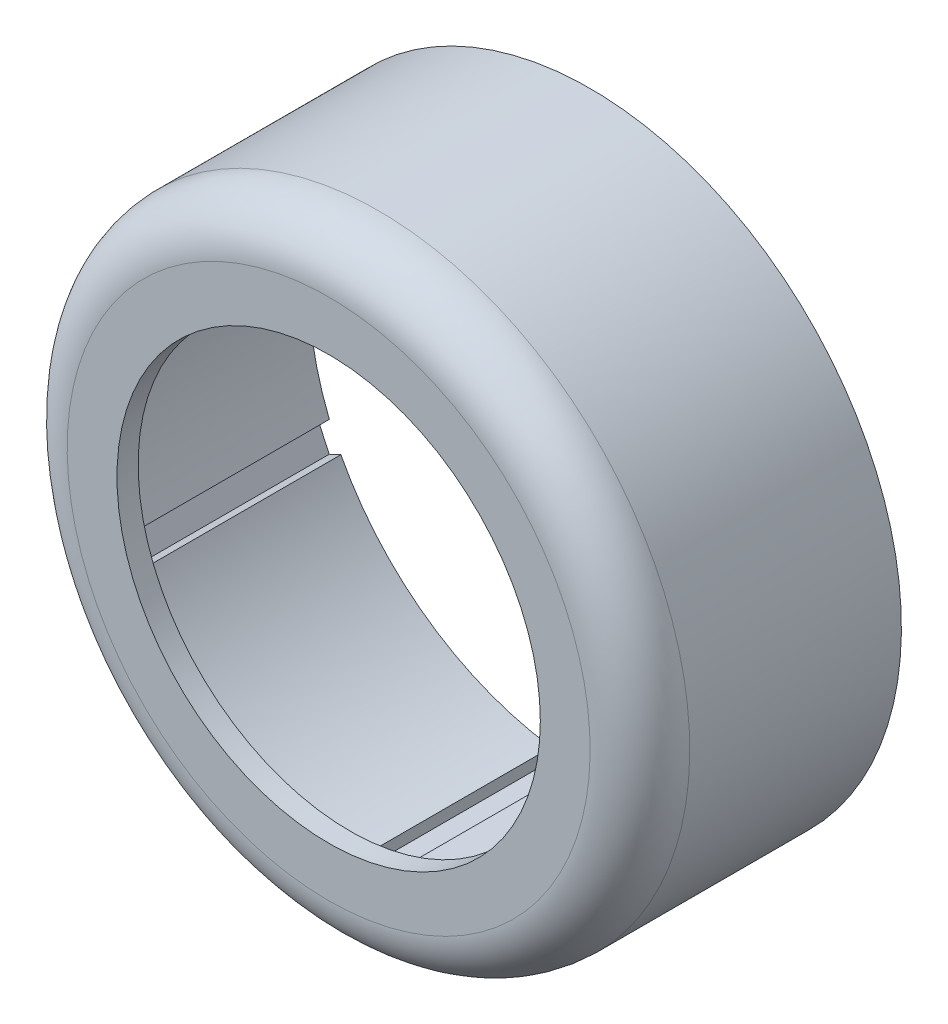
ISO-10303-21;
HEADER;
FILE_DESCRIPTION(('STEP AP214'),'2;1');
FILE_NAME('part.step','',(''),(''),'','','');
FILE_SCHEMA(('AUTOMOTIVE_DESIGN { 1 0 10303 214 1 1 1 1 }'));
ENDSEC;
DATA;
#1=APPLICATION_CONTEXT('core data for automotive mechanical design processes');
#2=APPLICATION_PROTOCOL_DEFINITION('international standard','automotive_design',2000,#1);
#3=PRODUCT_CONTEXT('',#1,'mechanical');
#4=PRODUCT('Part','Part','',(#3));
#5=PRODUCT_RELATED_PRODUCT_CATEGORY('part','',(#4));
#6=PRODUCT_DEFINITION_FORMATION('','',#4);
#7=PRODUCT_DEFINITION_CONTEXT('part definition',#1,'design');
#8=PRODUCT_DEFINITION('design','',#6,#7);
#9=PRODUCT_DEFINITION_SHAPE('','',#8);
#10=(LENGTH_UNIT() NAMED_UNIT(*) SI_UNIT(.MILLI.,.METRE.));
#11=(NAMED_UNIT(*) PLANE_ANGLE_UNIT() SI_UNIT($,.RADIAN.));
#12=(NAMED_UNIT(*) SI_UNIT($,.STERADIAN.) SOLID_ANGLE_UNIT());
#13=UNCERTAINTY_MEASURE_WITH_UNIT(LENGTH_MEASURE(1.E-05),#10,'distance_accuracy_value','');
#14=(GEOMETRIC_REPRESENTATION_CONTEXT(3) GLOBAL_UNCERTAINTY_ASSIGNED_CONTEXT((#13)) GLOBAL_UNIT_ASSIGNED_CONTEXT((#10,
#11,#12)) REPRESENTATION_CONTEXT('',''));
#15=CARTESIAN_POINT('',(0.,0.,0.));
#16=DIRECTION('',(0.,0.,1.));
#17=DIRECTION('',(1.,0.,0.));
#18=AXIS2_PLACEMENT_3D('',#15,#16,#17);
#19=CARTESIAN_POINT('',(0.,0.,-221.545741472244));
#20=DIRECTION('',(0.,0.,-1.));
#21=DIRECTION('',(-1.,0.,0.));
#22=AXIS2_PLACEMENT_3D('',#19,#20,#21);
#23=CYLINDRICAL_SURFACE('',#22,22.6);
#24=DIRECTION('',(0.,0.,-1.));
#25=VECTOR('',#24,1.);
#26=CARTESIAN_POINT('',(-19.091867612019,12.0938245019985,-221.545741472244));
#27=LINE('',#26,#25);
#28=CARTESIAN_POINT('',(-19.091867612019,12.0938245019985,-223.245741472244));
#29=VERTEX_POINT('',#28);
#30=CARTESIAN_POINT('',(-19.091867612019,12.0938245019985,-242.545741472244));
#31=VERTEX_POINT('',#30);
#32=EDGE_CURVE('E221',#29,#31,#27,.T.);
#33=ORIENTED_EDGE('',*,*,#32,.F.);
#34=CARTESIAN_POINT('',(0.,0.,-223.245741472244));
#35=DIRECTION('',(0.,0.,1.));
#36=DIRECTION('',(1.,0.,0.));
#37=AXIS2_PLACEMENT_3D('',#34,#35,#36);
#38=CIRCLE('',#37,22.6);
#39=CARTESIAN_POINT('',(-20.9443010701167,-8.49095122376218,-223.245741472244));
#40=VERTEX_POINT('',#39);
#41=EDGE_CURVE('E51',#29,#40,#38,.T.);
#42=ORIENTED_EDGE('',*,*,#41,.T.);
#43=DIRECTION('',(0.,0.,-1.));
#44=VECTOR('',#43,1.);
#45=CARTESIAN_POINT('',(-20.9443010701167,-8.49095122376218,-221.545741472244));
#46=LINE('',#45,#44);
#47=CARTESIAN_POINT('',(-20.9443010701167,-8.49095122376218,-242.545741472244));
#48=VERTEX_POINT('',#47);
#49=EDGE_CURVE('E205',#40,#48,#46,.T.);
#50=ORIENTED_EDGE('',*,*,#49,.T.);
#51=CARTESIAN_POINT('',(0.,0.,-242.545741472244));
#52=DIRECTION('',(0.,0.,1.));
#53=DIRECTION('',(0.,-1.,0.));
#54=AXIS2_PLACEMENT_3D('',#51,#52,#53);
#55=CIRCLE('',#54,22.6);
#56=EDGE_CURVE('E374',#31,#48,#55,.T.);
#57=ORIENTED_EDGE('',*,*,#56,.F.);
#58=EDGE_LOOP('',(#33,#42,#50,#57));
#59=FACE_BOUND('',#58,.T.);
#60=ADVANCED_FACE('F36',(#59),#23,.F.);
#61=CARTESIAN_POINT('',(-0.462404008235553,0.998089441466983,-221.545741472244));
#62=DIRECTION('',(0.420367280211704,-0.907354037698304,0.));
#63=DIRECTION('',(0.907354037698304,0.420367280211704,0.));
#64=AXIS2_PLACEMENT_3D('',#61,#62,#63);
#65=PLANE('',#64);
#66=ORIENTED_EDGE('',*,*,#49,.F.);
#67=DIRECTION('',(-0.907354037698304,-0.420367280211704,0.));
#68=VECTOR('',#67,1.);
#69=CARTESIAN_POINT('',(-0.462404008235553,0.998089441466983,-223.245741472244));
#70=LINE('',#69,#68);
#71=CARTESIAN_POINT('',(-21.8759592979131,-8.92257837152811,-223.245741472244));
#72=VERTEX_POINT('',#71);
#73=EDGE_CURVE('E378',#40,#72,#70,.T.);
#74=ORIENTED_EDGE('',*,*,#73,.T.);
#75=DIRECTION('',(0.,0.,-1.));
#76=VECTOR('',#75,1.);
#77=CARTESIAN_POINT('',(-21.8759592979131,-8.92257837152811,-221.545741472244));
#78=LINE('',#77,#76);
#79=CARTESIAN_POINT('',(-21.8759592979131,-8.92257837152811,-242.545741472244));
#80=VERTEX_POINT('',#79);
#81=EDGE_CURVE('E59',#72,#80,#78,.T.);
#82=ORIENTED_EDGE('',*,*,#81,.T.);
#83=DIRECTION('',(-0.907354037698304,-0.420367280211704,0.));
#84=VECTOR('',#83,1.);
#85=CARTESIAN_POINT('',(-0.462404008235553,0.998089441466983,-242.545741472244));
#86=LINE('',#85,#84);
#87=EDGE_CURVE('E371',#48,#80,#86,.T.);
#88=ORIENTED_EDGE('',*,*,#87,.F.);
#89=EDGE_LOOP('',(#66,#74,#82,#88));
#90=FACE_BOUND('',#89,.T.);
#91=ADVANCED_FACE('F283',(#90),#65,.T.);
#92=CARTESIAN_POINT('',(-21.4135552896795,-9.92066781299784,-221.545741472244));
#93=DIRECTION('',(0.907354037698303,0.420367280211706,0.));
#94=DIRECTION('',(-0.420367280211706,0.907354037698303,0.));
#95=AXIS2_PLACEMENT_3D('',#92,#93,#94);
#96=PLANE('',#95);
#97=ORIENTED_EDGE('',*,*,#81,.F.);
#98=DIRECTION('',(0.420367280211706,-0.907354037698303,0.));
#99=VECTOR('',#98,1.);
#100=CARTESIAN_POINT('',(-21.4135552896795,-9.92066781299784,-223.245741472244));
#101=LINE('',#100,#99);
#102=CARTESIAN_POINT('',(-20.9511512814474,-10.9187572544644,-223.245741472244));
#103=VERTEX_POINT('',#102);
#104=EDGE_CURVE('E380',#72,#103,#101,.T.);
#105=ORIENTED_EDGE('',*,*,#104,.T.);
#106=DIRECTION('',(0.,0.,-1.));
#107=VECTOR('',#106,1.);
#108=CARTESIAN_POINT('',(-20.9511512814474,-10.9187572544644,-221.545741472244));
#109=LINE('',#108,#107);
#110=CARTESIAN_POINT('',(-20.9511512814474,-10.9187572544644,-242.545741472244));
#111=VERTEX_POINT('',#110);
#112=EDGE_CURVE('E264',#103,#111,#109,.T.);
#113=ORIENTED_EDGE('',*,*,#112,.T.);
#114=DIRECTION('',(0.420367280211706,-0.907354037698303,0.));
#115=VECTOR('',#114,1.);
#116=CARTESIAN_POINT('',(-21.4135552896795,-9.92066781299784,-242.545741472244));
#117=LINE('',#116,#115);
#118=EDGE_CURVE('E368',#80,#111,#117,.T.);
#119=ORIENTED_EDGE('',*,*,#118,.F.);
#120=EDGE_LOOP('',(#97,#105,#113,#119));
#121=FACE_BOUND('',#120,.T.);
#122=ADVANCED_FACE('F289',(#121),#96,.T.);
#123=CARTESIAN_POINT('',(0.462404008230186,-0.99808944146926,-221.545741472244));
#124=DIRECTION('',(-0.420367280211705,0.907354037698303,0.));
#125=DIRECTION('',(-0.907354037698303,-0.420367280211705,0.));
#126=AXIS2_PLACEMENT_3D('',#123,#124,#125);
#127=PLANE('',#126);
#128=ORIENTED_EDGE('',*,*,#112,.F.);
#129=DIRECTION('',(0.907354037698303,0.420367280211705,0.));
#130=VECTOR('',#129,1.);
#131=CARTESIAN_POINT('',(0.462404008230186,-0.99808944146926,-223.245741472244));
#132=LINE('',#131,#130);
#133=CARTESIAN_POINT('',(-20.019493053651,-10.4871301066984,-223.245741472244));
#134=VERTEX_POINT('',#133);
#135=EDGE_CURVE('E383',#103,#134,#132,.T.);
#136=ORIENTED_EDGE('',*,*,#135,.T.);
#137=DIRECTION('',(0.,0.,-1.));
#138=VECTOR('',#137,1.);
#139=CARTESIAN_POINT('',(-20.019493053651,-10.4871301066984,-221.545741472244));
#140=LINE('',#139,#138);
#141=CARTESIAN_POINT('',(-20.019493053651,-10.4871301066984,-242.545741472244));
#142=VERTEX_POINT('',#141);
#143=EDGE_CURVE('E262',#134,#142,#140,.T.);
#144=ORIENTED_EDGE('',*,*,#143,.T.);
#145=DIRECTION('',(0.907354037698303,0.420367280211705,0.));
#146=VECTOR('',#145,1.);
#147=CARTESIAN_POINT('',(0.462404008230186,-0.99808944146926,-242.545741472244));
#148=LINE('',#147,#146);
#149=EDGE_CURVE('E365',#111,#142,#148,.T.);
#150=ORIENTED_EDGE('',*,*,#149,.F.);
#151=EDGE_LOOP('',(#128,#136,#144,#150));
#152=FACE_BOUND('',#151,.T.);
#153=ADVANCED_FACE('F525',(#152),#127,.T.);
#154=CARTESIAN_POINT('',(0.,0.,-221.545741472244));
#155=DIRECTION('',(0.,0.,-1.));
#156=DIRECTION('',(-1.,0.,0.));
#157=AXIS2_PLACEMENT_3D('',#154,#155,#156);
#158=CYLINDRICAL_SURFACE('',#157,22.6);
#159=ORIENTED_EDGE('',*,*,#143,.F.);
#160=CARTESIAN_POINT('',(0.,0.,-223.245741472244));
#161=DIRECTION('',(0.,0.,1.));
#162=DIRECTION('',(1.,0.,0.));
#163=AXIS2_PLACEMENT_3D('',#160,#161,#162);
#164=CIRCLE('',#163,22.6);
#165=CARTESIAN_POINT('',(-3.11877107298575,-22.3837724031118,-223.245741472244));
#166=VERTEX_POINT('',#165);
#167=EDGE_CURVE('E386',#134,#166,#164,.T.);
#168=ORIENTED_EDGE('',*,*,#167,.T.);
#169=DIRECTION('',(0.,0.,-1.));
#170=VECTOR('',#169,1.);
#171=CARTESIAN_POINT('',(-3.11877107298575,-22.3837724031118,-221.545741472244));
#172=LINE('',#171,#170);
#173=CARTESIAN_POINT('',(-3.11877107298575,-22.3837724031118,-242.545741472244));
#174=VERTEX_POINT('',#173);
#175=EDGE_CURVE('E260',#166,#174,#172,.T.);
#176=ORIENTED_EDGE('',*,*,#175,.T.);
#177=CARTESIAN_POINT('',(0.,0.,-242.545741472244));
#178=DIRECTION('',(0.,0.,1.));
#179=DIRECTION('',(0.,-1.,0.));
#180=AXIS2_PLACEMENT_3D('',#177,#178,#179);
#181=CIRCLE('',#180,22.6);
#182=EDGE_CURVE('E362',#142,#174,#181,.T.);
#183=ORIENTED_EDGE('',*,*,#182,.F.);
#184=EDGE_LOOP('',(#159,#168,#176,#183));
#185=FACE_BOUND('',#184,.T.);
#186=ADVANCED_FACE('F521',(#185),#158,.F.);
#187=CARTESIAN_POINT('',(-1.09557281567726,0.0985911027897949,-221.545741472244));
#188=DIRECTION('',(0.995975286978966,-0.089628275266042,0.));
#189=DIRECTION('',(0.089628275266042,0.995975286978967,0.));
#190=AXIS2_PLACEMENT_3D('',#187,#188,#189);
#191=PLANE('',#190);
#192=ORIENTED_EDGE('',*,*,#175,.F.);
#193=DIRECTION('',(-0.089628275266042,-0.995975286978967,0.));
#194=VECTOR('',#193,1.);
#195=CARTESIAN_POINT('',(-1.09557281567726,0.0985911027897949,-223.245741472244));
#196=LINE('',#195,#194);
#197=CARTESIAN_POINT('',(-3.2108001119556,-23.406425669911,-223.245741472244));
#198=VERTEX_POINT('',#197);
#199=EDGE_CURVE('E389',#166,#198,#196,.T.);
#200=ORIENTED_EDGE('',*,*,#199,.T.);
#201=DIRECTION('',(0.,0.,-1.));
#202=VECTOR('',#201,1.);
#203=CARTESIAN_POINT('',(-3.2108001119556,-23.406425669911,-221.545741472244));
#204=LINE('',#203,#202);
#205=CARTESIAN_POINT('',(-3.2108001119556,-23.406425669911,-242.545741472244));
#206=VERTEX_POINT('',#205);
#207=EDGE_CURVE('E258',#198,#206,#204,.T.);
#208=ORIENTED_EDGE('',*,*,#207,.T.);
#209=DIRECTION('',(-0.089628275266042,-0.995975286978967,0.));
#210=VECTOR('',#209,1.);
#211=CARTESIAN_POINT('',(-1.09557281567726,0.0985911027897949,-242.545741472244));
#212=LINE('',#211,#210);
#213=EDGE_CURVE('E359',#174,#206,#212,.T.);
#214=ORIENTED_EDGE('',*,*,#213,.F.);
#215=EDGE_LOOP('',(#192,#200,#208,#214));
#216=FACE_BOUND('',#215,.T.);
#217=ADVANCED_FACE('F517',(#216),#191,.T.);
#218=CARTESIAN_POINT('',(-2.11522729628026,-23.5050167727036,-221.545741472244));
#219=DIRECTION('',(0.0896282752660405,0.995975286978967,0.));
#220=DIRECTION('',(-0.995975286978967,0.0896282752660405,0.));
#221=AXIS2_PLACEMENT_3D('',#218,#219,#220);
#222=PLANE('',#221);
#223=ORIENTED_EDGE('',*,*,#207,.F.);
#224=DIRECTION('',(0.995975286978967,-0.0896282752660405,0.));
#225=VECTOR('',#224,1.);
#226=CARTESIAN_POINT('',(-2.11522729628026,-23.5050167727036,-223.245741472244));
#227=LINE('',#226,#225);
#228=CARTESIAN_POINT('',(-1.01965448060188,-23.6036078754963,-223.245741472244));
#229=VERTEX_POINT('',#228);
#230=EDGE_CURVE('E392',#198,#229,#227,.T.);
#231=ORIENTED_EDGE('',*,*,#230,.T.);
#232=DIRECTION('',(0.,0.,-1.));
#233=VECTOR('',#232,1.);
#234=CARTESIAN_POINT('',(-1.01965448060188,-23.6036078754963,-221.545741472244));
#235=LINE('',#234,#233);
#236=CARTESIAN_POINT('',(-1.01965448060188,-23.6036078754963,-242.545741472244));
#237=VERTEX_POINT('',#236);
#238=EDGE_CURVE('E256',#229,#237,#235,.T.);
#239=ORIENTED_EDGE('',*,*,#238,.T.);
#240=DIRECTION('',(0.995975286978967,-0.0896282752660405,0.));
#241=VECTOR('',#240,1.);
#242=CARTESIAN_POINT('',(-2.11522729628026,-23.5050167727036,-242.545741472244));
#243=LINE('',#242,#241);
#244=EDGE_CURVE('E356',#206,#237,#243,.T.);
#245=ORIENTED_EDGE('',*,*,#244,.F.);
#246=EDGE_LOOP('',(#223,#231,#239,#245));
#247=FACE_BOUND('',#246,.T.);
#248=ADVANCED_FACE('F513',(#247),#222,.T.);
#249=CARTESIAN_POINT('',(1.09557281567649,-0.0985911027955016,-221.545741472244));
#250=DIRECTION('',(-0.995975286978966,0.0896282752660433,0.));
#251=DIRECTION('',(-0.0896282752660433,-0.995975286978966,0.));
#252=AXIS2_PLACEMENT_3D('',#249,#250,#251);
#253=PLANE('',#252);
#254=ORIENTED_EDGE('',*,*,#238,.F.);
#255=DIRECTION('',(0.0896282752660433,0.995975286978966,0.));
#256=VECTOR('',#255,1.);
#257=CARTESIAN_POINT('',(1.09557281567649,-0.0985911027955016,-223.245741472244));
#258=LINE('',#257,#256);
#259=CARTESIAN_POINT('',(-0.927625441632022,-22.5809546086971,-223.245741472244));
#260=VERTEX_POINT('',#259);
#261=EDGE_CURVE('E395',#229,#260,#258,.T.);
#262=ORIENTED_EDGE('',*,*,#261,.T.);
#263=DIRECTION('',(0.,0.,-1.));
#264=VECTOR('',#263,1.);
#265=CARTESIAN_POINT('',(-0.927625441632022,-22.5809546086971,-221.545741472244));
#266=LINE('',#265,#264);
#267=CARTESIAN_POINT('',(-0.927625441632022,-22.5809546086971,-242.545741472244));
#268=VERTEX_POINT('',#267);
#269=EDGE_CURVE('E254',#260,#268,#266,.T.);
#270=ORIENTED_EDGE('',*,*,#269,.T.);
#271=DIRECTION('',(0.0896282752660433,0.995975286978966,0.));
#272=VECTOR('',#271,1.);
#273=CARTESIAN_POINT('',(1.09557281567649,-0.0985911027955016,-242.545741472244));
#274=LINE('',#273,#272);
#275=EDGE_CURVE('E353',#237,#268,#274,.T.);
#276=ORIENTED_EDGE('',*,*,#275,.F.);
#277=EDGE_LOOP('',(#254,#262,#270,#276));
#278=FACE_BOUND('',#277,.T.);
#279=ADVANCED_FACE('F509',(#278),#253,.T.);
#280=CARTESIAN_POINT('',(0.,0.,-221.545741472244));
#281=DIRECTION('',(0.,0.,-1.));
#282=DIRECTION('',(-1.,0.,0.));
#283=AXIS2_PLACEMENT_3D('',#280,#281,#282);
#284=CYLINDRICAL_SURFACE('',#283,22.6);
#285=ORIENTED_EDGE('',*,*,#269,.F.);
#286=CARTESIAN_POINT('',(0.,0.,-223.245741472244));
#287=DIRECTION('',(0.,0.,1.));
#288=DIRECTION('',(1.,0.,0.));
#289=AXIS2_PLACEMENT_3D('',#286,#287,#288);
#290=CIRCLE('',#289,22.6);
#291=CARTESIAN_POINT('',(17.8255299971311,-13.8928211793495,-223.245741472244));
#292=VERTEX_POINT('',#291);
#293=EDGE_CURVE('E398',#260,#292,#290,.T.);
#294=ORIENTED_EDGE('',*,*,#293,.T.);
#295=DIRECTION('',(0.,0.,-1.));
#296=VECTOR('',#295,1.);
#297=CARTESIAN_POINT('',(17.8255299971311,-13.8928211793495,-221.545741472244));
#298=LINE('',#297,#296);
#299=CARTESIAN_POINT('',(17.8255299971311,-13.8928211793495,-242.545741472244));
#300=VERTEX_POINT('',#299);
#301=EDGE_CURVE('E252',#292,#300,#298,.T.);
#302=ORIENTED_EDGE('',*,*,#301,.T.);
#303=CARTESIAN_POINT('',(0.,0.,-242.545741472244));
#304=DIRECTION('',(0.,0.,1.));
#305=DIRECTION('',(0.,-1.,0.));
#306=AXIS2_PLACEMENT_3D('',#303,#304,#305);
#307=CIRCLE('',#306,22.6);
#308=EDGE_CURVE('E350',#268,#300,#307,.T.);
#309=ORIENTED_EDGE('',*,*,#308,.F.);
#310=EDGE_LOOP('',(#285,#294,#302,#309));
#311=FACE_BOUND('',#310,.T.);
#312=ADVANCED_FACE('F505',(#311),#284,.F.);
#313=CARTESIAN_POINT('',(-0.633168807444037,-0.899498338675497,-221.545741472244));
#314=DIRECTION('',(0.575608006767259,0.817725762432262,0.));
#315=DIRECTION('',(-0.817725762432262,0.575608006767259,0.));
#316=AXIS2_PLACEMENT_3D('',#313,#314,#315);
#317=PLANE('',#316);
#318=ORIENTED_EDGE('',*,*,#301,.F.);
#319=DIRECTION('',(0.817725762432262,-0.575608006767259,0.));
#320=VECTOR('',#319,1.);
#321=CARTESIAN_POINT('',(-0.633168807444037,-0.899498338675497,-223.245741472244));
#322=LINE('',#321,#320);
#323=CARTESIAN_POINT('',(18.6651591859574,-14.4838472983828,-223.245741472244));
#324=VERTEX_POINT('',#323);
#325=EDGE_CURVE('E401',#292,#324,#322,.T.);
#326=ORIENTED_EDGE('',*,*,#325,.T.);
#327=DIRECTION('',(0.,0.,-1.));
#328=VECTOR('',#327,1.);
#329=CARTESIAN_POINT('',(18.6651591859574,-14.4838472983828,-221.545741472244));
#330=LINE('',#329,#328);
#331=CARTESIAN_POINT('',(18.6651591859574,-14.4838472983828,-242.545741472244));
#332=VERTEX_POINT('',#331);
#333=EDGE_CURVE('E250',#324,#332,#330,.T.);
#334=ORIENTED_EDGE('',*,*,#333,.T.);
#335=DIRECTION('',(0.817725762432262,-0.575608006767259,0.));
#336=VECTOR('',#335,1.);
#337=CARTESIAN_POINT('',(-0.633168807444037,-0.899498338675497,-242.545741472244));
#338=LINE('',#337,#336);
#339=EDGE_CURVE('E347',#300,#332,#338,.T.);
#340=ORIENTED_EDGE('',*,*,#339,.F.);
#341=EDGE_LOOP('',(#318,#326,#334,#340));
#342=FACE_BOUND('',#341,.T.);
#343=ADVANCED_FACE('F501',(#342),#317,.T.);
#344=CARTESIAN_POINT('',(19.2983279933994,-13.5843489597101,-221.545741472244));
#345=DIRECTION('',(-0.817725762432261,0.57560800676726,0.));
#346=DIRECTION('',(-0.57560800676726,-0.817725762432261,0.));
#347=AXIS2_PLACEMENT_3D('',#344,#345,#346);
#348=PLANE('',#347);
#349=ORIENTED_EDGE('',*,*,#333,.F.);
#350=DIRECTION('',(0.57560800676726,0.817725762432261,0.));
#351=VECTOR('',#350,1.);
#352=CARTESIAN_POINT('',(19.2983279933994,-13.5843489597101,-223.245741472244));
#353=LINE('',#352,#351);
#354=CARTESIAN_POINT('',(19.9314968008453,-12.6848506210319,-223.245741472244));
#355=VERTEX_POINT('',#354);
#356=EDGE_CURVE('E404',#324,#355,#353,.T.);
#357=ORIENTED_EDGE('',*,*,#356,.T.);
#358=DIRECTION('',(0.,0.,-1.));
#359=VECTOR('',#358,1.);
#360=CARTESIAN_POINT('',(19.9314968008453,-12.6848506210319,-221.545741472244));
#361=LINE('',#360,#359);
#362=CARTESIAN_POINT('',(19.9314968008453,-12.6848506210319,-242.545741472244));
#363=VERTEX_POINT('',#362);
#364=EDGE_CURVE('E248',#355,#363,#361,.T.);
#365=ORIENTED_EDGE('',*,*,#364,.T.);
#366=DIRECTION('',(0.57560800676726,0.817725762432261,0.));
#367=VECTOR('',#366,1.);
#368=CARTESIAN_POINT('',(19.2983279933994,-13.5843489597101,-242.545741472244));
#369=LINE('',#368,#367);
#370=EDGE_CURVE('E344',#332,#363,#369,.T.);
#371=ORIENTED_EDGE('',*,*,#370,.F.);
#372=EDGE_LOOP('',(#349,#357,#365,#371));
#373=FACE_BOUND('',#372,.T.);
#374=ADVANCED_FACE('F497',(#373),#348,.T.);
#375=CARTESIAN_POINT('',(0.633168807443969,0.899498338675527,-221.545741472244));
#376=DIRECTION('',(-0.575608006767261,-0.81772576243226,0.));
#377=DIRECTION('',(0.81772576243226,-0.575608006767261,0.));
#378=AXIS2_PLACEMENT_3D('',#375,#376,#377);
#379=PLANE('',#378);
#380=ORIENTED_EDGE('',*,*,#364,.F.);
#381=DIRECTION('',(-0.81772576243226,0.575608006767261,0.));
#382=VECTOR('',#381,1.);
#383=CARTESIAN_POINT('',(0.633168807443969,0.899498338675527,-223.245741472244));
#384=LINE('',#383,#382);
#385=CARTESIAN_POINT('',(19.091867612019,-12.0938245019985,-223.245741472244));
#386=VERTEX_POINT('',#385);
#387=EDGE_CURVE('E407',#355,#386,#384,.T.);
#388=ORIENTED_EDGE('',*,*,#387,.T.);
#389=DIRECTION('',(0.,0.,-1.));
#390=VECTOR('',#389,1.);
#391=CARTESIAN_POINT('',(19.091867612019,-12.0938245019985,-221.545741472244));
#392=LINE('',#391,#390);
#393=CARTESIAN_POINT('',(19.091867612019,-12.0938245019985,-242.545741472244));
#394=VERTEX_POINT('',#393);
#395=EDGE_CURVE('E246',#386,#394,#392,.T.);
#396=ORIENTED_EDGE('',*,*,#395,.T.);
#397=DIRECTION('',(-0.81772576243226,0.575608006767261,0.));
#398=VECTOR('',#397,1.);
#399=CARTESIAN_POINT('',(0.633168807443969,0.899498338675527,-242.545741472244));
#400=LINE('',#399,#398);
#401=EDGE_CURVE('E341',#363,#394,#400,.T.);
#402=ORIENTED_EDGE('',*,*,#401,.F.);
#403=EDGE_LOOP('',(#380,#388,#396,#402));
#404=FACE_BOUND('',#403,.T.);
#405=ADVANCED_FACE('F493',(#404),#379,.T.);
#406=CARTESIAN_POINT('',(0.,0.,-221.545741472244));
#407=DIRECTION('',(0.,0.,-1.));
#408=DIRECTION('',(-1.,0.,0.));
#409=AXIS2_PLACEMENT_3D('',#406,#407,#408);
#410=CYLINDRICAL_SURFACE('',#409,22.6);
#411=ORIENTED_EDGE('',*,*,#395,.F.);
#412=CARTESIAN_POINT('',(0.,0.,-223.245741472244));
#413=DIRECTION('',(0.,0.,1.));
#414=DIRECTION('',(1.,0.,0.));
#415=AXIS2_PLACEMENT_3D('',#412,#413,#414);
#416=CIRCLE('',#415,22.6);
#417=CARTESIAN_POINT('',(20.9443010701166,8.49095122376245,-223.245741472244));
#418=VERTEX_POINT('',#417);
#419=EDGE_CURVE('E410',#386,#418,#416,.T.);
#420=ORIENTED_EDGE('',*,*,#419,.T.);
#421=DIRECTION('',(0.,0.,-1.));
#422=VECTOR('',#421,1.);
#423=CARTESIAN_POINT('',(20.9443010701166,8.49095122376245,-221.545741472244));
#424=LINE('',#423,#422);
#425=CARTESIAN_POINT('',(20.9443010701166,8.49095122376245,-242.545741472244));
#426=VERTEX_POINT('',#425);
#427=EDGE_CURVE('E244',#418,#426,#424,.T.);
#428=ORIENTED_EDGE('',*,*,#427,.T.);
#429=CARTESIAN_POINT('',(0.,0.,-242.545741472244));
#430=DIRECTION('',(0.,0.,1.));
#431=DIRECTION('',(0.,-1.,0.));
#432=AXIS2_PLACEMENT_3D('',#429,#430,#431);
#433=CIRCLE('',#432,22.6);
#434=EDGE_CURVE('E338',#394,#426,#433,.T.);
#435=ORIENTED_EDGE('',*,*,#434,.F.);
#436=EDGE_LOOP('',(#411,#420,#428,#435));
#437=FACE_BOUND('',#436,.T.);
#438=ADVANCED_FACE('F489',(#437),#410,.F.);
#439=CARTESIAN_POINT('',(0.462404008230195,-0.998089441469268,-221.545741472244));
#440=DIRECTION('',(-0.420367280211709,0.907354037698301,0.));
#441=DIRECTION('',(-0.907354037698301,-0.420367280211709,0.));
#442=AXIS2_PLACEMENT_3D('',#439,#440,#441);
#443=PLANE('',#442);
#444=ORIENTED_EDGE('',*,*,#427,.F.);
#445=DIRECTION('',(0.907354037698301,0.420367280211709,0.));
#446=VECTOR('',#445,1.);
#447=CARTESIAN_POINT('',(0.462404008230195,-0.998089441469268,-223.245741472244));
#448=LINE('',#447,#446);
#449=CARTESIAN_POINT('',(21.8759592979125,8.92257837152819,-223.245741472244));
#450=VERTEX_POINT('',#449);
#451=EDGE_CURVE('E413',#418,#450,#448,.T.);
#452=ORIENTED_EDGE('',*,*,#451,.T.);
#453=DIRECTION('',(0.,0.,-1.));
#454=VECTOR('',#453,1.);
#455=CARTESIAN_POINT('',(21.8759592979125,8.92257837152819,-221.545741472244));
#456=LINE('',#455,#454);
#457=CARTESIAN_POINT('',(21.8759592979125,8.92257837152819,-242.545741472244));
#458=VERTEX_POINT('',#457);
#459=EDGE_CURVE('E242',#450,#458,#456,.T.);
#460=ORIENTED_EDGE('',*,*,#459,.T.);
#461=DIRECTION('',(0.907354037698301,0.420367280211709,0.));
#462=VECTOR('',#461,1.);
#463=CARTESIAN_POINT('',(0.462404008230195,-0.998089441469268,-242.545741472244));
#464=LINE('',#463,#462);
#465=EDGE_CURVE('E335',#426,#458,#464,.T.);
#466=ORIENTED_EDGE('',*,*,#465,.F.);
#467=EDGE_LOOP('',(#444,#452,#460,#466));
#468=FACE_BOUND('',#467,.T.);
#469=ADVANCED_FACE('F485',(#468),#443,.T.);
#470=CARTESIAN_POINT('',(21.4135552896804,9.92066781299472,-221.545741472244));
#471=DIRECTION('',(-0.907354037698302,-0.420367280211708,0.));
#472=DIRECTION('',(0.420367280211708,-0.907354037698302,0.));
#473=AXIS2_PLACEMENT_3D('',#470,#471,#472);
#474=PLANE('',#473);
#475=ORIENTED_EDGE('',*,*,#459,.F.);
#476=DIRECTION('',(-0.420367280211708,0.907354037698302,0.));
#477=VECTOR('',#476,1.);
#478=CARTESIAN_POINT('',(21.4135552896804,9.92066781299472,-223.245741472244));
#479=LINE('',#478,#477);
#480=CARTESIAN_POINT('',(20.9511512814468,10.9187572544644,-223.245741472244));
#481=VERTEX_POINT('',#480);
#482=EDGE_CURVE('E416',#450,#481,#479,.T.);
#483=ORIENTED_EDGE('',*,*,#482,.T.);
#484=DIRECTION('',(0.,0.,-1.));
#485=VECTOR('',#484,1.);
#486=CARTESIAN_POINT('',(20.9511512814468,10.9187572544644,-221.545741472244));
#487=LINE('',#486,#485);
#488=CARTESIAN_POINT('',(20.9511512814468,10.9187572544644,-242.545741472244));
#489=VERTEX_POINT('',#488);
#490=EDGE_CURVE('E240',#481,#489,#487,.T.);
#491=ORIENTED_EDGE('',*,*,#490,.T.);
#492=DIRECTION('',(-0.420367280211708,0.907354037698302,0.));
#493=VECTOR('',#492,1.);
#494=CARTESIAN_POINT('',(21.4135552896804,9.92066781299472,-242.545741472244));
#495=LINE('',#494,#493);
#496=EDGE_CURVE('E332',#458,#489,#495,.T.);
#497=ORIENTED_EDGE('',*,*,#496,.F.);
#498=EDGE_LOOP('',(#475,#483,#491,#497));
#499=FACE_BOUND('',#498,.T.);
#500=ADVANCED_FACE('F481',(#499),#474,.T.);
#501=CARTESIAN_POINT('',(-0.462404008235533,0.998089441466918,-221.545741472244));
#502=DIRECTION('',(0.420367280211712,-0.9073540376983,0.));
#503=DIRECTION('',(0.9073540376983,0.420367280211712,0.));
#504=AXIS2_PLACEMENT_3D('',#501,#502,#503);
#505=PLANE('',#504);
#506=ORIENTED_EDGE('',*,*,#490,.F.);
#507=DIRECTION('',(-0.9073540376983,-0.420367280211712,0.));
#508=VECTOR('',#507,1.);
#509=CARTESIAN_POINT('',(-0.462404008235533,0.998089441466918,-223.245741472244));
#510=LINE('',#509,#508);
#511=CARTESIAN_POINT('',(20.0194930536508,10.4871301066987,-223.245741472244));
#512=VERTEX_POINT('',#511);
#513=EDGE_CURVE('E419',#481,#512,#510,.T.);
#514=ORIENTED_EDGE('',*,*,#513,.T.);
#515=DIRECTION('',(0.,0.,-1.));
#516=VECTOR('',#515,1.);
#517=CARTESIAN_POINT('',(20.0194930536508,10.4871301066987,-221.545741472244));
#518=LINE('',#517,#516);
#519=CARTESIAN_POINT('',(20.0194930536508,10.4871301066987,-242.545741472244));
#520=VERTEX_POINT('',#519);
#521=EDGE_CURVE('E238',#512,#520,#518,.T.);
#522=ORIENTED_EDGE('',*,*,#521,.T.);
#523=DIRECTION('',(-0.9073540376983,-0.420367280211712,0.));
#524=VECTOR('',#523,1.);
#525=CARTESIAN_POINT('',(-0.462404008235533,0.998089441466918,-242.545741472244));
#526=LINE('',#525,#524);
#527=EDGE_CURVE('E329',#489,#520,#526,.T.);
#528=ORIENTED_EDGE('',*,*,#527,.F.);
#529=EDGE_LOOP('',(#506,#514,#522,#528));
#530=FACE_BOUND('',#529,.T.);
#531=ADVANCED_FACE('F477',(#530),#505,.T.);
#532=CARTESIAN_POINT('',(0.,0.,-221.545741472244));
#533=DIRECTION('',(0.,0.,-1.));
#534=DIRECTION('',(-1.,0.,0.));
#535=AXIS2_PLACEMENT_3D('',#532,#533,#534);
#536=CYLINDRICAL_SURFACE('',#535,22.6);
#537=ORIENTED_EDGE('',*,*,#521,.F.);
#538=CARTESIAN_POINT('',(0.,0.,-223.245741472244));
#539=DIRECTION('',(0.,0.,1.));
#540=DIRECTION('',(1.,0.,0.));
#541=AXIS2_PLACEMENT_3D('',#538,#539,#540);
#542=CIRCLE('',#541,22.6);
#543=CARTESIAN_POINT('',(3.11877107298546,22.3837724031118,-223.245741472244));
#544=VERTEX_POINT('',#543);
#545=EDGE_CURVE('E422',#512,#544,#542,.T.);
#546=ORIENTED_EDGE('',*,*,#545,.T.);
#547=DIRECTION('',(0.,0.,-1.));
#548=VECTOR('',#547,1.);
#549=CARTESIAN_POINT('',(3.11877107298546,22.3837724031118,-221.545741472244));
#550=LINE('',#549,#548);
#551=CARTESIAN_POINT('',(3.11877107298546,22.3837724031118,-242.545741472244));
#552=VERTEX_POINT('',#551);
#553=EDGE_CURVE('E236',#544,#552,#550,.T.);
#554=ORIENTED_EDGE('',*,*,#553,.T.);
#555=CARTESIAN_POINT('',(0.,0.,-242.545741472244));
#556=DIRECTION('',(0.,0.,1.));
#557=DIRECTION('',(0.,-1.,0.));
#558=AXIS2_PLACEMENT_3D('',#555,#556,#557);
#559=CIRCLE('',#558,22.6);
#560=EDGE_CURVE('E326',#520,#552,#559,.T.);
#561=ORIENTED_EDGE('',*,*,#560,.F.);
#562=EDGE_LOOP('',(#537,#546,#554,#561));
#563=FACE_BOUND('',#562,.T.);
#564=ADVANCED_FACE('F473',(#563),#536,.F.);
#565=CARTESIAN_POINT('',(1.09557281567643,-0.0985911027954956,-221.545741472244));
#566=DIRECTION('',(-0.995975286978966,0.0896282752660432,0.));
#567=DIRECTION('',(-0.0896282752660432,-0.995975286978966,0.));
#568=AXIS2_PLACEMENT_3D('',#565,#566,#567);
#569=PLANE('',#568);
#570=ORIENTED_EDGE('',*,*,#553,.F.);
#571=DIRECTION('',(0.0896282752660432,0.995975286978966,0.));
#572=VECTOR('',#571,1.);
#573=CARTESIAN_POINT('',(1.09557281567643,-0.0985911027954956,-223.245741472244));
#574=LINE('',#573,#572);
#575=CARTESIAN_POINT('',(3.2108001119553,23.4064256699109,-223.245741472244));
#576=VERTEX_POINT('',#575);
#577=EDGE_CURVE('E425',#544,#576,#574,.T.);
#578=ORIENTED_EDGE('',*,*,#577,.T.);
#579=DIRECTION('',(0.,0.,-1.));
#580=VECTOR('',#579,1.);
#581=CARTESIAN_POINT('',(3.2108001119553,23.4064256699109,-221.545741472244));
#582=LINE('',#581,#580);
#583=CARTESIAN_POINT('',(3.2108001119553,23.4064256699109,-242.545741472244));
#584=VERTEX_POINT('',#583);
#585=EDGE_CURVE('E234',#576,#584,#582,.T.);
#586=ORIENTED_EDGE('',*,*,#585,.T.);
#587=DIRECTION('',(0.0896282752660432,0.995975286978966,0.));
#588=VECTOR('',#587,1.);
#589=CARTESIAN_POINT('',(1.09557281567643,-0.0985911027954956,-242.545741472244));
#590=LINE('',#589,#588);
#591=EDGE_CURVE('E323',#552,#584,#590,.T.);
#592=ORIENTED_EDGE('',*,*,#591,.F.);
#593=EDGE_LOOP('',(#570,#578,#586,#592));
#594=FACE_BOUND('',#593,.T.);
#595=ADVANCED_FACE('F469',(#594),#569,.T.);
#596=CARTESIAN_POINT('',(2.11522729627681,23.5050167727037,-221.545741472244));
#597=DIRECTION('',(-0.0896282752660386,-0.995975286978967,0.));
#598=DIRECTION('',(0.995975286978967,-0.0896282752660386,0.));
#599=AXIS2_PLACEMENT_3D('',#596,#597,#598);
#600=PLANE('',#599);
#601=ORIENTED_EDGE('',*,*,#585,.F.);
#602=DIRECTION('',(-0.995975286978967,0.0896282752660386,0.));
#603=VECTOR('',#602,1.);
#604=CARTESIAN_POINT('',(2.11522729627681,23.5050167727037,-223.245741472244));
#605=LINE('',#604,#603);
#606=CARTESIAN_POINT('',(1.01965448060157,23.6036078754962,-223.245741472244));
#607=VERTEX_POINT('',#606);
#608=EDGE_CURVE('E428',#576,#607,#605,.T.);
#609=ORIENTED_EDGE('',*,*,#608,.T.);
#610=DIRECTION('',(0.,0.,-1.));
#611=VECTOR('',#610,1.);
#612=CARTESIAN_POINT('',(1.01965448060157,23.6036078754962,-221.545741472244));
#613=LINE('',#612,#611);
#614=CARTESIAN_POINT('',(1.01965448060157,23.6036078754962,-242.545741472244));
#615=VERTEX_POINT('',#614);
#616=EDGE_CURVE('E232',#607,#615,#613,.T.);
#617=ORIENTED_EDGE('',*,*,#616,.T.);
#618=DIRECTION('',(-0.995975286978967,0.0896282752660386,0.));
#619=VECTOR('',#618,1.);
#620=CARTESIAN_POINT('',(2.11522729627681,23.5050167727037,-242.545741472244));
#621=LINE('',#620,#619);
#622=EDGE_CURVE('E320',#584,#615,#621,.T.);
#623=ORIENTED_EDGE('',*,*,#622,.F.);
#624=EDGE_LOOP('',(#601,#609,#617,#623));
#625=FACE_BOUND('',#624,.T.);
#626=ADVANCED_FACE('F465',(#625),#600,.T.);
#627=CARTESIAN_POINT('',(-1.09557281567726,0.0985911027897939,-221.545741472244));
#628=DIRECTION('',(0.995975286978967,-0.0896282752660413,0.));
#629=DIRECTION('',(0.0896282752660413,0.995975286978967,0.));
#630=AXIS2_PLACEMENT_3D('',#627,#628,#629);
#631=PLANE('',#630);
#632=ORIENTED_EDGE('',*,*,#616,.F.);
#633=DIRECTION('',(-0.0896282752660413,-0.995975286978967,0.));
#634=VECTOR('',#633,1.);
#635=CARTESIAN_POINT('',(-1.09557281567726,0.0985911027897939,-223.245741472244));
#636=LINE('',#635,#634);
#637=CARTESIAN_POINT('',(0.927625441631727,22.5809546086971,-223.245741472244));
#638=VERTEX_POINT('',#637);
#639=EDGE_CURVE('E431',#607,#638,#636,.T.);
#640=ORIENTED_EDGE('',*,*,#639,.T.);
#641=DIRECTION('',(0.,0.,-1.));
#642=VECTOR('',#641,1.);
#643=CARTESIAN_POINT('',(0.927625441631727,22.5809546086971,-221.545741472244));
#644=LINE('',#643,#642);
#645=CARTESIAN_POINT('',(0.927625441631727,22.5809546086971,-242.545741472244));
#646=VERTEX_POINT('',#645);
#647=EDGE_CURVE('E230',#638,#646,#644,.T.);
#648=ORIENTED_EDGE('',*,*,#647,.T.);
#649=DIRECTION('',(-0.0896282752660413,-0.995975286978967,0.));
#650=VECTOR('',#649,1.);
#651=CARTESIAN_POINT('',(-1.09557281567726,0.0985911027897939,-242.545741472244));
#652=LINE('',#651,#650);
#653=EDGE_CURVE('E317',#615,#646,#652,.T.);
#654=ORIENTED_EDGE('',*,*,#653,.F.);
#655=EDGE_LOOP('',(#632,#640,#648,#654));
#656=FACE_BOUND('',#655,.T.);
#657=ADVANCED_FACE('F461',(#656),#631,.T.);
#658=CARTESIAN_POINT('',(0.,0.,-221.545741472244));
#659=DIRECTION('',(0.,0.,-1.));
#660=DIRECTION('',(-1.,0.,0.));
#661=AXIS2_PLACEMENT_3D('',#658,#659,#660);
#662=CYLINDRICAL_SURFACE('',#661,22.6);
#663=ORIENTED_EDGE('',*,*,#647,.F.);
#664=CARTESIAN_POINT('',(0.,0.,-223.245741472244));
#665=DIRECTION('',(0.,0.,1.));
#666=DIRECTION('',(1.,0.,0.));
#667=AXIS2_PLACEMENT_3D('',#664,#665,#666);
#668=CIRCLE('',#667,22.6);
#669=CARTESIAN_POINT('',(-17.8255299971311,13.8928211793495,-223.245741472244));
#670=VERTEX_POINT('',#669);
#671=EDGE_CURVE('E434',#638,#670,#668,.T.);
#672=ORIENTED_EDGE('',*,*,#671,.T.);
#673=DIRECTION('',(0.,0.,-1.));
#674=VECTOR('',#673,1.);
#675=CARTESIAN_POINT('',(-17.8255299971311,13.8928211793495,-221.545741472244));
#676=LINE('',#675,#674);
#677=CARTESIAN_POINT('',(-17.8255299971311,13.8928211793495,-242.545741472244));
#678=VERTEX_POINT('',#677);
#679=EDGE_CURVE('E223',#670,#678,#676,.T.);
#680=ORIENTED_EDGE('',*,*,#679,.T.);
#681=CARTESIAN_POINT('',(0.,0.,-242.545741472244));
#682=DIRECTION('',(0.,0.,1.));
#683=DIRECTION('',(0.,-1.,0.));
#684=AXIS2_PLACEMENT_3D('',#681,#682,#683);
#685=CIRCLE('',#684,22.6);
#686=EDGE_CURVE('E314',#646,#678,#685,.T.);
#687=ORIENTED_EDGE('',*,*,#686,.F.);
#688=EDGE_LOOP('',(#663,#672,#680,#687));
#689=FACE_BOUND('',#688,.T.);
#690=ADVANCED_FACE('F457',(#689),#662,.F.);
#691=CARTESIAN_POINT('',(0.633168807443897,0.899498338675418,-221.545741472244));
#692=DIRECTION('',(-0.575608006767264,-0.817725762432258,0.));
#693=DIRECTION('',(0.817725762432258,-0.575608006767264,0.));
#694=AXIS2_PLACEMENT_3D('',#691,#692,#693);
#695=PLANE('',#694);
#696=ORIENTED_EDGE('',*,*,#679,.F.);
#697=DIRECTION('',(-0.817725762432258,0.575608006767264,0.));
#698=VECTOR('',#697,1.);
#699=CARTESIAN_POINT('',(0.633168807443897,0.899498338675418,-223.245741472244));
#700=LINE('',#699,#698);
#701=CARTESIAN_POINT('',(-18.6651591859574,14.4838472983828,-223.245741472244));
#702=VERTEX_POINT('',#701);
#703=EDGE_CURVE('E214',#670,#702,#700,.T.);
#704=ORIENTED_EDGE('',*,*,#703,.T.);
#705=DIRECTION('',(0.,0.,-1.));
#706=VECTOR('',#705,1.);
#707=CARTESIAN_POINT('',(-18.6651591859574,14.4838472983828,-221.545741472244));
#708=LINE('',#707,#706);
#709=CARTESIAN_POINT('',(-18.6651591859574,14.4838472983828,-242.545741472244));
#710=VERTEX_POINT('',#709);
#711=EDGE_CURVE('E213',#702,#710,#708,.T.);
#712=ORIENTED_EDGE('',*,*,#711,.T.);
#713=DIRECTION('',(-0.817725762432258,0.575608006767264,0.));
#714=VECTOR('',#713,1.);
#715=CARTESIAN_POINT('',(0.633168807443897,0.899498338675418,-242.545741472244));
#716=LINE('',#715,#714);
#717=EDGE_CURVE('E311',#678,#710,#716,.T.);
#718=ORIENTED_EDGE('',*,*,#717,.F.);
#719=EDGE_LOOP('',(#696,#704,#712,#718));
#720=FACE_BOUND('',#719,.T.);
#721=ADVANCED_FACE('F454',(#720),#695,.T.);
#722=CARTESIAN_POINT('',(-19.2983279934033,13.5843489597046,-221.545741472244));
#723=DIRECTION('',(0.81772576243226,-0.575608006767261,0.));
#724=DIRECTION('',(0.575608006767261,0.81772576243226,0.));
#725=AXIS2_PLACEMENT_3D('',#722,#723,#724);
#726=PLANE('',#725);
#727=ORIENTED_EDGE('',*,*,#711,.F.);
#728=DIRECTION('',(-0.575608006767261,-0.81772576243226,0.));
#729=VECTOR('',#728,1.);
#730=CARTESIAN_POINT('',(-19.2983279934033,13.5843489597046,-223.245741472244));
#731=LINE('',#730,#729);
#732=CARTESIAN_POINT('',(-19.9314968008453,12.6848506210319,-223.245741472244));
#733=VERTEX_POINT('',#732);
#734=EDGE_CURVE('E200',#702,#733,#731,.T.);
#735=ORIENTED_EDGE('',*,*,#734,.T.);
#736=DIRECTION('',(0.,0.,-1.));
#737=VECTOR('',#736,1.);
#738=CARTESIAN_POINT('',(-19.9314968008453,12.6848506210319,-221.545741472244));
#739=LINE('',#738,#737);
#740=CARTESIAN_POINT('',(-19.9314968008453,12.6848506210319,-242.545741472244));
#741=VERTEX_POINT('',#740);
#742=EDGE_CURVE('E211',#733,#741,#739,.T.);
#743=ORIENTED_EDGE('',*,*,#742,.T.);
#744=DIRECTION('',(-0.575608006767261,-0.81772576243226,0.));
#745=VECTOR('',#744,1.);
#746=CARTESIAN_POINT('',(-19.2983279934033,13.5843489597046,-242.545741472244));
#747=LINE('',#746,#745);
#748=EDGE_CURVE('E307',#710,#741,#747,.T.);
#749=ORIENTED_EDGE('',*,*,#748,.F.);
#750=EDGE_LOOP('',(#727,#735,#743,#749));
#751=FACE_BOUND('',#750,.T.);
#752=ADVANCED_FACE('F209',(#751),#726,.T.);
#753=CARTESIAN_POINT('',(-0.633168807444028,-0.899498338675478,-221.545741472244));
#754=DIRECTION('',(0.575608006767261,0.81772576243226,0.));
#755=DIRECTION('',(-0.81772576243226,0.575608006767261,0.));
#756=AXIS2_PLACEMENT_3D('',#753,#754,#755);
#757=PLANE('',#756);
#758=ORIENTED_EDGE('',*,*,#742,.F.);
#759=DIRECTION('',(0.81772576243226,-0.575608006767261,0.));
#760=VECTOR('',#759,1.);
#761=CARTESIAN_POINT('',(-0.633168807444028,-0.899498338675478,-223.245741472244));
#762=LINE('',#761,#760);
#763=EDGE_CURVE('E196',#733,#29,#762,.T.);
#764=ORIENTED_EDGE('',*,*,#763,.T.);
#765=ORIENTED_EDGE('',*,*,#32,.T.);
#766=DIRECTION('',(0.81772576243226,-0.575608006767261,0.));
#767=VECTOR('',#766,1.);
#768=CARTESIAN_POINT('',(-0.633168807444028,-0.899498338675478,-242.545741472244));
#769=LINE('',#768,#767);
#770=EDGE_CURVE('E219',#741,#31,#769,.T.);
#771=ORIENTED_EDGE('',*,*,#770,.F.);
#772=EDGE_LOOP('',(#758,#764,#765,#771));
#773=FACE_BOUND('',#772,.T.);
#774=ADVANCED_FACE('F217',(#773),#757,.T.);
#775=CARTESIAN_POINT('',(0.,0.,-221.545741472244));
#776=DIRECTION('',(0.,0.,1.));
#777=DIRECTION('',(0.,-1.,0.));
#778=AXIS2_PLACEMENT_3D('',#775,#776,#777);
#779=PLANE('',#778);
#780=CARTESIAN_POINT('',(0.,0.,-221.545741472244));
#781=DIRECTION('',(0.,0.,1.));
#782=DIRECTION('',(0.,-1.,0.));
#783=AXIS2_PLACEMENT_3D('',#780,#781,#782);
#784=CIRCLE('',#783,21.);
#785=CARTESIAN_POINT('',(0.,-21.,-221.545741472244));
#786=VERTEX_POINT('',#785);
#787=EDGE_CURVE('E44',#786,#786,#784,.T.);
#788=ORIENTED_EDGE('',*,*,#787,.T.);
#789=EDGE_LOOP('',(#788));
#790=FACE_BOUND('',#789,.T.);
#791=CARTESIAN_POINT('',(0.,0.,-221.545741472244));
#792=DIRECTION('',(0.,0.,1.));
#793=DIRECTION('',(1.,0.,0.));
#794=AXIS2_PLACEMENT_3D('',#791,#792,#793);
#795=CIRCLE('',#794,17.);
#796=CARTESIAN_POINT('',(17.,0.,-221.545741472244));
#797=VERTEX_POINT('',#796);
#798=EDGE_CURVE('E438',#797,#797,#795,.T.);
#799=ORIENTED_EDGE('',*,*,#798,.F.);
#800=EDGE_LOOP('',(#799));
#801=FACE_BOUND('',#800,.T.);
#802=ADVANCED_FACE('F270',(#790,#801),#779,.T.);
#803=CARTESIAN_POINT('',(0.,0.,-221.545741472244));
#804=DIRECTION('',(0.,0.,-1.));
#805=DIRECTION('',(-1.,0.,0.));
#806=AXIS2_PLACEMENT_3D('',#803,#804,#805);
#807=CYLINDRICAL_SURFACE('',#806,25.);
#808=CARTESIAN_POINT('',(0.,0.,-225.545741472244));
#809=DIRECTION('',(0.,0.,1.));
#810=DIRECTION('',(0.,-1.,0.));
#811=AXIS2_PLACEMENT_3D('',#808,#809,#810);
#812=CIRCLE('',#811,25.);
#813=CARTESIAN_POINT('',(0.,-25.,-225.545741472244));
#814=VERTEX_POINT('',#813);
#815=EDGE_CURVE('E11',#814,#814,#812,.F.);
#816=ORIENTED_EDGE('',*,*,#815,.T.);
#817=EDGE_LOOP('',(#816));
#818=FACE_BOUND('',#817,.T.);
#819=CARTESIAN_POINT('',(0.,0.,-242.545741472244));
#820=DIRECTION('',(0.,0.,1.));
#821=DIRECTION('',(0.,-1.,0.));
#822=AXIS2_PLACEMENT_3D('',#819,#820,#821);
#823=CIRCLE('',#822,25.);
#824=CARTESIAN_POINT('',(0.,-25.,-242.545741472244));
#825=VERTEX_POINT('',#824);
#826=EDGE_CURVE('E225',#825,#825,#823,.T.);
#827=ORIENTED_EDGE('',*,*,#826,.T.);
#828=EDGE_LOOP('',(#827));
#829=FACE_BOUND('',#828,.T.);
#830=ADVANCED_FACE('F294',(#818,#829),#807,.T.);
#831=CARTESIAN_POINT('',(0.,0.,-242.545741472244));
#832=DIRECTION('',(0.,0.,1.));
#833=DIRECTION('',(0.,-1.,0.));
#834=AXIS2_PLACEMENT_3D('',#831,#832,#833);
#835=PLANE('',#834);
#836=ORIENTED_EDGE('',*,*,#770,.T.);
#837=ORIENTED_EDGE('',*,*,#56,.T.);
#838=ORIENTED_EDGE('',*,*,#87,.T.);
#839=ORIENTED_EDGE('',*,*,#118,.T.);
#840=ORIENTED_EDGE('',*,*,#149,.T.);
#841=ORIENTED_EDGE('',*,*,#182,.T.);
#842=ORIENTED_EDGE('',*,*,#213,.T.);
#843=ORIENTED_EDGE('',*,*,#244,.T.);
#844=ORIENTED_EDGE('',*,*,#275,.T.);
#845=ORIENTED_EDGE('',*,*,#308,.T.);
#846=ORIENTED_EDGE('',*,*,#339,.T.);
#847=ORIENTED_EDGE('',*,*,#370,.T.);
#848=ORIENTED_EDGE('',*,*,#401,.T.);
#849=ORIENTED_EDGE('',*,*,#434,.T.);
#850=ORIENTED_EDGE('',*,*,#465,.T.);
#851=ORIENTED_EDGE('',*,*,#496,.T.);
#852=ORIENTED_EDGE('',*,*,#527,.T.);
#853=ORIENTED_EDGE('',*,*,#560,.T.);
#854=ORIENTED_EDGE('',*,*,#591,.T.);
#855=ORIENTED_EDGE('',*,*,#622,.T.);
#856=ORIENTED_EDGE('',*,*,#653,.T.);
#857=ORIENTED_EDGE('',*,*,#686,.T.);
#858=ORIENTED_EDGE('',*,*,#717,.T.);
#859=ORIENTED_EDGE('',*,*,#748,.T.);
#860=EDGE_LOOP('',(#836,#837,#838,#839,#840,#841,#842,#843,#844,#845,#846,#847,#848,#849,#850,
#851,#852,#853,#854,#855,#856,#857,#858,#859));
#861=FACE_BOUND('',#860,.T.);
#862=ORIENTED_EDGE('',*,*,#826,.F.);
#863=EDGE_LOOP('',(#862));
#864=FACE_BOUND('',#863,.T.);
#865=ADVANCED_FACE('F296',(#861,#864),#835,.F.);
#866=CARTESIAN_POINT('',(0.,0.,-223.245741472244));
#867=DIRECTION('',(0.,0.,1.));
#868=DIRECTION('',(1.,0.,0.));
#869=AXIS2_PLACEMENT_3D('',#866,#867,#868);
#870=PLANE('',#869);
#871=ORIENTED_EDGE('',*,*,#41,.F.);
#872=ORIENTED_EDGE('',*,*,#763,.F.);
#873=ORIENTED_EDGE('',*,*,#734,.F.);
#874=ORIENTED_EDGE('',*,*,#703,.F.);
#875=ORIENTED_EDGE('',*,*,#671,.F.);
#876=ORIENTED_EDGE('',*,*,#639,.F.);
#877=ORIENTED_EDGE('',*,*,#608,.F.);
#878=ORIENTED_EDGE('',*,*,#577,.F.);
#879=ORIENTED_EDGE('',*,*,#545,.F.);
#880=ORIENTED_EDGE('',*,*,#513,.F.);
#881=ORIENTED_EDGE('',*,*,#482,.F.);
#882=ORIENTED_EDGE('',*,*,#451,.F.);
#883=ORIENTED_EDGE('',*,*,#419,.F.);
#884=ORIENTED_EDGE('',*,*,#387,.F.);
#885=ORIENTED_EDGE('',*,*,#356,.F.);
#886=ORIENTED_EDGE('',*,*,#325,.F.);
#887=ORIENTED_EDGE('',*,*,#293,.F.);
#888=ORIENTED_EDGE('',*,*,#261,.F.);
#889=ORIENTED_EDGE('',*,*,#230,.F.);
#890=ORIENTED_EDGE('',*,*,#199,.F.);
#891=ORIENTED_EDGE('',*,*,#167,.F.);
#892=ORIENTED_EDGE('',*,*,#135,.F.);
#893=ORIENTED_EDGE('',*,*,#104,.F.);
#894=ORIENTED_EDGE('',*,*,#73,.F.);
#895=EDGE_LOOP('',(#871,#872,#873,#874,#875,#876,#877,#878,#879,#880,#881,#882,#883,#884,#885,
#886,#887,#888,#889,#890,#891,#892,#893,#894));
#896=FACE_BOUND('',#895,.T.);
#897=CARTESIAN_POINT('',(0.,0.,-223.245741472244));
#898=DIRECTION('',(0.,0.,1.));
#899=DIRECTION('',(1.,0.,0.));
#900=AXIS2_PLACEMENT_3D('',#897,#898,#899);
#901=CIRCLE('',#900,17.);
#902=CARTESIAN_POINT('',(17.,0.,-223.245741472244));
#903=VERTEX_POINT('',#902);
#904=EDGE_CURVE('E215',#903,#903,#901,.T.);
#905=ORIENTED_EDGE('',*,*,#904,.T.);
#906=EDGE_LOOP('',(#905));
#907=FACE_BOUND('',#906,.T.);
#908=ADVANCED_FACE('F198',(#896,#907),#870,.F.);
#909=CARTESIAN_POINT('',(0.,0.,-223.245741472244));
#910=DIRECTION('',(0.,0.,1.));
#911=DIRECTION('',(1.,0.,0.));
#912=AXIS2_PLACEMENT_3D('',#909,#910,#911);
#913=CYLINDRICAL_SURFACE('',#912,17.);
#914=ORIENTED_EDGE('',*,*,#904,.F.);
#915=EDGE_LOOP('',(#914));
#916=FACE_BOUND('',#915,.T.);
#917=ORIENTED_EDGE('',*,*,#798,.T.);
#918=EDGE_LOOP('',(#917));
#919=FACE_BOUND('',#918,.T.);
#920=ADVANCED_FACE('F274',(#916,#919),#913,.F.);
#921=CARTESIAN_POINT('',(0.,0.,-225.545741472244));
#922=DIRECTION('',(0.,0.,1.));
#923=DIRECTION('',(0.,-1.,0.));
#924=AXIS2_PLACEMENT_3D('',#921,#922,#923);
#925=TOROIDAL_SURFACE('',#924,21.,4.);
#926=ORIENTED_EDGE('',*,*,#815,.F.);
#927=EDGE_LOOP('',(#926));
#928=FACE_BOUND('',#927,.T.);
#929=ORIENTED_EDGE('',*,*,#787,.F.);
#930=EDGE_LOOP('',(#929));
#931=FACE_BOUND('',#930,.T.);
#932=ADVANCED_FACE('F38',(#928,#931),#925,.T.);
#933=CLOSED_SHELL('',(#60,#91,#122,#153,#186,#217,#248,#279,#312,#343,#374,#405,#438,#469,#500,
#531,#564,#595,#626,#657,#690,#721,#752,#774,#802,#830,#865,#908,#920,#932));
#934=MANIFOLD_SOLID_BREP('B2',#933);
#935=ADVANCED_BREP_SHAPE_REPRESENTATION('',(#18,#934),#14);
#936=SHAPE_DEFINITION_REPRESENTATION(#9,#935);
ENDSEC;
END-ISO-10303-21;
